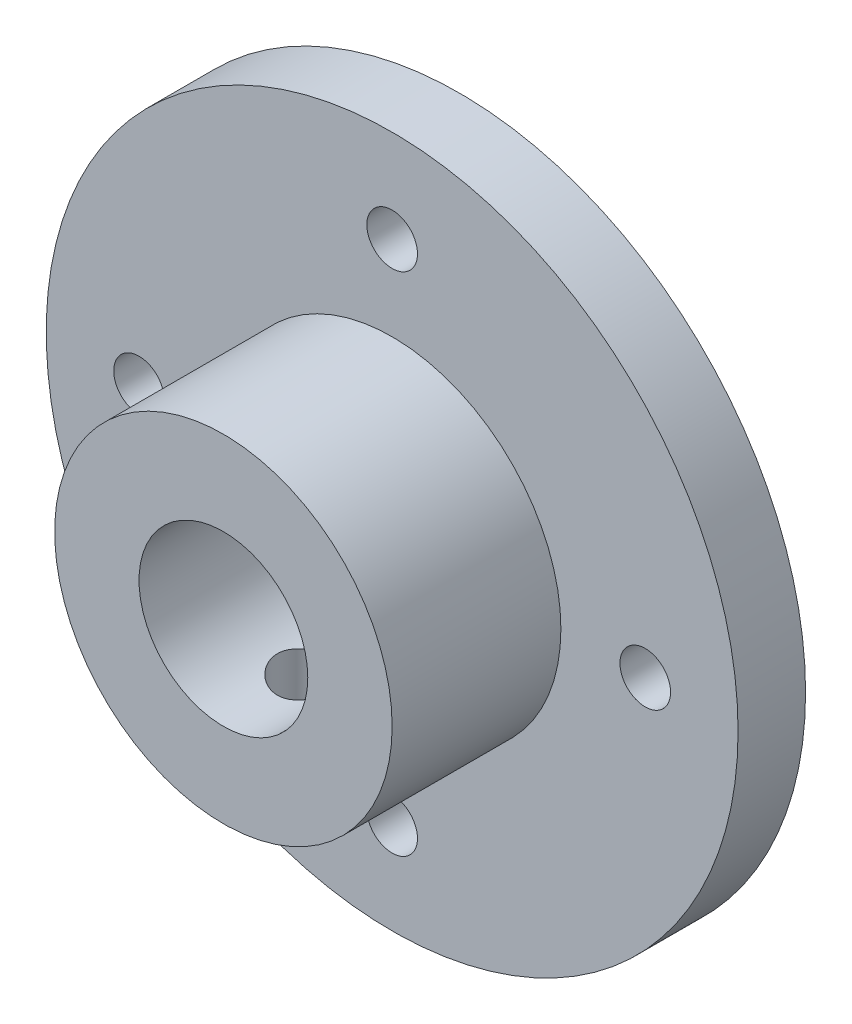
ISO-10303-21;
HEADER;
FILE_DESCRIPTION(('STEP AP214'),'2;1');
FILE_NAME('part.step','',(''),(''),'','','');
FILE_SCHEMA(('AUTOMOTIVE_DESIGN { 1 0 10303 214 1 1 1 1 }'));
ENDSEC;
DATA;
#1=APPLICATION_CONTEXT('core data for automotive mechanical design processes');
#2=APPLICATION_PROTOCOL_DEFINITION('international standard','automotive_design',2000,#1);
#3=PRODUCT_CONTEXT('',#1,'mechanical');
#4=PRODUCT('Part','Part','',(#3));
#5=PRODUCT_RELATED_PRODUCT_CATEGORY('part','',(#4));
#6=PRODUCT_DEFINITION_FORMATION('','',#4);
#7=PRODUCT_DEFINITION_CONTEXT('part definition',#1,'design');
#8=PRODUCT_DEFINITION('design','',#6,#7);
#9=PRODUCT_DEFINITION_SHAPE('','',#8);
#10=(LENGTH_UNIT() NAMED_UNIT(*) SI_UNIT(.MILLI.,.METRE.));
#11=(NAMED_UNIT(*) PLANE_ANGLE_UNIT() SI_UNIT($,.RADIAN.));
#12=(NAMED_UNIT(*) SI_UNIT($,.STERADIAN.) SOLID_ANGLE_UNIT());
#13=UNCERTAINTY_MEASURE_WITH_UNIT(LENGTH_MEASURE(1.E-05),#10,'distance_accuracy_value','');
#14=(GEOMETRIC_REPRESENTATION_CONTEXT(3) GLOBAL_UNCERTAINTY_ASSIGNED_CONTEXT((#13)) GLOBAL_UNIT_ASSIGNED_CONTEXT((#10,
#11,#12)) REPRESENTATION_CONTEXT('',''));
#15=CARTESIAN_POINT('',(0.,0.,0.));
#16=DIRECTION('',(0.,0.,1.));
#17=DIRECTION('',(1.,0.,0.));
#18=AXIS2_PLACEMENT_3D('',#15,#16,#17);
#19=CARTESIAN_POINT('',(0.,0.,4.));
#20=DIRECTION('',(0.,0.,1.));
#21=DIRECTION('',(1.,0.,0.));
#22=AXIS2_PLACEMENT_3D('',#19,#20,#21);
#23=PLANE('',#22);
#24=CARTESIAN_POINT('',(-15.,0.,4.));
#25=DIRECTION('',(0.,0.,1.));
#26=DIRECTION('',(1.,0.,0.));
#27=AXIS2_PLACEMENT_3D('',#24,#25,#26);
#28=CIRCLE('',#27,1.50000000000023);
#29=CARTESIAN_POINT('',(-13.4999999999998,0.,4.));
#30=VERTEX_POINT('',#29);
#31=EDGE_CURVE('E71',#30,#30,#28,.T.);
#32=ORIENTED_EDGE('',*,*,#31,.F.);
#33=EDGE_LOOP('',(#32));
#34=FACE_BOUND('',#33,.T.);
#35=CARTESIAN_POINT('',(15.,0.,4.));
#36=DIRECTION('',(0.,0.,1.));
#37=DIRECTION('',(1.,0.,0.));
#38=AXIS2_PLACEMENT_3D('',#35,#36,#37);
#39=CIRCLE('',#38,1.50000000000055);
#40=CARTESIAN_POINT('',(16.5000000000005,0.,4.));
#41=VERTEX_POINT('',#40);
#42=EDGE_CURVE('E59',#41,#41,#39,.T.);
#43=ORIENTED_EDGE('',*,*,#42,.F.);
#44=EDGE_LOOP('',(#43));
#45=FACE_BOUND('',#44,.T.);
#46=CARTESIAN_POINT('',(0.,0.,4.));
#47=DIRECTION('',(0.,0.,1.));
#48=DIRECTION('',(1.,0.,0.));
#49=AXIS2_PLACEMENT_3D('',#46,#47,#48);
#50=CIRCLE('',#49,20.5);
#51=CARTESIAN_POINT('',(20.5,0.,4.));
#52=VERTEX_POINT('',#51);
#53=EDGE_CURVE('E10',#52,#52,#50,.T.);
#54=ORIENTED_EDGE('',*,*,#53,.T.);
#55=EDGE_LOOP('',(#54));
#56=FACE_BOUND('',#55,.T.);
#57=CARTESIAN_POINT('',(0.,15.,4.));
#58=DIRECTION('',(0.,0.,1.));
#59=DIRECTION('',(1.,0.,0.));
#60=AXIS2_PLACEMENT_3D('',#57,#58,#59);
#61=CIRCLE('',#60,1.5);
#62=CARTESIAN_POINT('',(1.5,15.,4.));
#63=VERTEX_POINT('',#62);
#64=EDGE_CURVE('E55',#63,#63,#61,.T.);
#65=ORIENTED_EDGE('',*,*,#64,.F.);
#66=EDGE_LOOP('',(#65));
#67=FACE_BOUND('',#66,.T.);
#68=CARTESIAN_POINT('',(0.,-15.,4.));
#69=DIRECTION('',(0.,0.,1.));
#70=DIRECTION('',(1.,0.,0.));
#71=AXIS2_PLACEMENT_3D('',#68,#69,#70);
#72=CIRCLE('',#71,1.50000000000081);
#73=CARTESIAN_POINT('',(1.50000000000081,-15.,4.));
#74=VERTEX_POINT('',#73);
#75=EDGE_CURVE('E65',#74,#74,#72,.T.);
#76=ORIENTED_EDGE('',*,*,#75,.F.);
#77=EDGE_LOOP('',(#76));
#78=FACE_BOUND('',#77,.T.);
#79=CARTESIAN_POINT('',(-9.71445146547012E-13,4.44089209850063E-13,4.));
#80=DIRECTION('',(0.,0.,1.));
#81=DIRECTION('',(1.,0.,0.));
#82=AXIS2_PLACEMENT_3D('',#79,#80,#81);
#83=CIRCLE('',#82,10.);
#84=CARTESIAN_POINT('',(9.99999999999903,4.44089209850063E-13,4.));
#85=VERTEX_POINT('',#84);
#86=EDGE_CURVE('E80',#85,#85,#83,.T.);
#87=ORIENTED_EDGE('',*,*,#86,.F.);
#88=EDGE_LOOP('',(#87));
#89=FACE_BOUND('',#88,.T.);
#90=ADVANCED_FACE('F33',(#34,#45,#56,#67,#78,#89),#23,.T.);
#91=CARTESIAN_POINT('',(0.,0.,0.));
#92=DIRECTION('',(0.,0.,1.));
#93=DIRECTION('',(1.,0.,0.));
#94=AXIS2_PLACEMENT_3D('',#91,#92,#93);
#95=PLANE('',#94);
#96=CARTESIAN_POINT('',(0.,0.,0.));
#97=DIRECTION('',(0.,0.,1.));
#98=DIRECTION('',(1.,0.,0.));
#99=AXIS2_PLACEMENT_3D('',#96,#97,#98);
#100=CIRCLE('',#99,20.5);
#101=CARTESIAN_POINT('',(20.5,0.,0.));
#102=VERTEX_POINT('',#101);
#103=EDGE_CURVE('E46',#102,#102,#100,.T.);
#104=ORIENTED_EDGE('',*,*,#103,.F.);
#105=EDGE_LOOP('',(#104));
#106=FACE_BOUND('',#105,.T.);
#107=CARTESIAN_POINT('',(0.,0.,0.));
#108=DIRECTION('',(0.,0.,1.));
#109=DIRECTION('',(1.,0.,0.));
#110=AXIS2_PLACEMENT_3D('',#107,#108,#109);
#111=CIRCLE('',#110,5.);
#112=CARTESIAN_POINT('',(5.,0.,0.));
#113=VERTEX_POINT('',#112);
#114=EDGE_CURVE('E51',#113,#113,#111,.T.);
#115=ORIENTED_EDGE('',*,*,#114,.T.);
#116=EDGE_LOOP('',(#115));
#117=FACE_BOUND('',#116,.T.);
#118=CARTESIAN_POINT('',(0.,15.,0.));
#119=DIRECTION('',(0.,0.,1.));
#120=DIRECTION('',(1.,0.,0.));
#121=AXIS2_PLACEMENT_3D('',#118,#119,#120);
#122=CIRCLE('',#121,1.5);
#123=CARTESIAN_POINT('',(1.5,15.,0.));
#124=VERTEX_POINT('',#123);
#125=EDGE_CURVE('E56',#124,#124,#122,.T.);
#126=ORIENTED_EDGE('',*,*,#125,.T.);
#127=EDGE_LOOP('',(#126));
#128=FACE_BOUND('',#127,.T.);
#129=CARTESIAN_POINT('',(15.,0.,0.));
#130=DIRECTION('',(0.,0.,1.));
#131=DIRECTION('',(1.,0.,0.));
#132=AXIS2_PLACEMENT_3D('',#129,#130,#131);
#133=CIRCLE('',#132,1.50000000000055);
#134=CARTESIAN_POINT('',(16.5000000000005,0.,0.));
#135=VERTEX_POINT('',#134);
#136=EDGE_CURVE('E62',#135,#135,#133,.T.);
#137=ORIENTED_EDGE('',*,*,#136,.T.);
#138=EDGE_LOOP('',(#137));
#139=FACE_BOUND('',#138,.T.);
#140=CARTESIAN_POINT('',(0.,-15.,0.));
#141=DIRECTION('',(0.,0.,1.));
#142=DIRECTION('',(1.,0.,0.));
#143=AXIS2_PLACEMENT_3D('',#140,#141,#142);
#144=CIRCLE('',#143,1.50000000000081);
#145=CARTESIAN_POINT('',(1.50000000000081,-15.,0.));
#146=VERTEX_POINT('',#145);
#147=EDGE_CURVE('E68',#146,#146,#144,.T.);
#148=ORIENTED_EDGE('',*,*,#147,.T.);
#149=EDGE_LOOP('',(#148));
#150=FACE_BOUND('',#149,.T.);
#151=CARTESIAN_POINT('',(-15.,0.,0.));
#152=DIRECTION('',(0.,0.,1.));
#153=DIRECTION('',(1.,0.,0.));
#154=AXIS2_PLACEMENT_3D('',#151,#152,#153);
#155=CIRCLE('',#154,1.50000000000023);
#156=CARTESIAN_POINT('',(-13.4999999999998,0.,0.));
#157=VERTEX_POINT('',#156);
#158=EDGE_CURVE('E74',#157,#157,#155,.T.);
#159=ORIENTED_EDGE('',*,*,#158,.T.);
#160=EDGE_LOOP('',(#159));
#161=FACE_BOUND('',#160,.T.);
#162=ADVANCED_FACE('F133',(#106,#117,#128,#139,#150,#161),#95,.F.);
#163=CARTESIAN_POINT('',(0.,0.,4.));
#164=DIRECTION('',(0.,0.,-1.));
#165=DIRECTION('',(-1.,0.,0.));
#166=AXIS2_PLACEMENT_3D('',#163,#164,#165);
#167=CYLINDRICAL_SURFACE('',#166,20.5);
#168=ORIENTED_EDGE('',*,*,#103,.T.);
#169=EDGE_LOOP('',(#168));
#170=FACE_BOUND('',#169,.T.);
#171=ORIENTED_EDGE('',*,*,#53,.F.);
#172=EDGE_LOOP('',(#171));
#173=FACE_BOUND('',#172,.T.);
#174=ADVANCED_FACE('F35',(#170,#173),#167,.T.);
#175=CARTESIAN_POINT('',(0.,0.,4.));
#176=DIRECTION('',(0.,0.,-1.));
#177=DIRECTION('',(-1.,0.,0.));
#178=AXIS2_PLACEMENT_3D('',#175,#176,#177);
#179=CYLINDRICAL_SURFACE('',#178,5.);
#180=CARTESIAN_POINT('',(0.,-5.,10.8));
#181=CARTESIAN_POINT('',(0.0977539005220656,-5.00000162894436,10.8000022486898));
#182=CARTESIAN_POINT('',(0.19549186859532,-4.99710773532688,10.7920115005329));
#183=CARTESIAN_POINT('',(0.388062069248583,-4.98585098452281,10.7603771045906));
#184=CARTESIAN_POINT('',(0.482894461923503,-4.9774884292245,10.7367343208487));
#185=CARTESIAN_POINT('',(0.666849296818671,-4.95619614793934,10.6747300717925));
#186=CARTESIAN_POINT('',(0.755981868052519,-4.94327480564127,10.6363956136333));
#187=CARTESIAN_POINT('',(0.926548260436039,-4.91416362291193,10.5462278905699));
#188=CARTESIAN_POINT('',(1.00798019364839,-4.89797298399385,10.4943913270383));
#189=CARTESIAN_POINT('',(1.16405881904559,-4.86328998573904,10.3765420249719));
#190=CARTESIAN_POINT('',(1.23835945318508,-4.84473608608493,10.3100892282884));
#191=CARTESIAN_POINT('',(1.37503534000585,-4.8077334249031,10.1658283101059));
#192=CARTESIAN_POINT('',(1.43740734602632,-4.78928469332118,10.0880171072778));
#193=CARTESIAN_POINT('',(1.55057074838351,-4.75387995818921,9.91996655892296));
#194=CARTESIAN_POINT('',(1.60088792826236,-4.73699749021945,9.82939085862481));
#195=CARTESIAN_POINT('',(1.6854228567842,-4.70758621826686,9.64035790602146));
#196=CARTESIAN_POINT('',(1.71964646378813,-4.69505583048048,9.54190353699426));
#197=CARTESIAN_POINT('',(1.76968160506977,-4.6764216481749,9.34387619235186));
#198=CARTESIAN_POINT('',(1.78614945231922,-4.67008963439852,9.24449121292766));
#199=CARTESIAN_POINT('',(1.80225793087739,-4.66389839037948,9.0441824060667));
#200=CARTESIAN_POINT('',(1.80190483021864,-4.66403674906515,8.94325916585017));
#201=CARTESIAN_POINT('',(1.78488611393202,-4.67057263169623,8.74858544763738));
#202=CARTESIAN_POINT('',(1.76910996810181,-4.67662885465459,8.65474367844102));
#203=CARTESIAN_POINT('',(1.7231561899951,-4.69375412059264,8.47114129370321));
#204=CARTESIAN_POINT('',(1.69297655939616,-4.70482385913068,8.38138124634822));
#205=CARTESIAN_POINT('',(1.61855003044875,-4.73094806499027,8.20660082941754));
#206=CARTESIAN_POINT('',(1.57406042926296,-4.74607046920848,8.12169440850682));
#207=CARTESIAN_POINT('',(1.47244565703815,-4.77857129112204,7.96028560459117));
#208=CARTESIAN_POINT('',(1.41531637409282,-4.79595044221429,7.88378596860743));
#209=CARTESIAN_POINT('',(1.2858992766173,-4.83231258907654,7.73640984648249));
#210=CARTESIAN_POINT('',(1.21289487774954,-4.85132846190871,7.66616928668949));
#211=CARTESIAN_POINT('',(1.05591731188325,-4.88789590383164,7.53874730697894));
#212=CARTESIAN_POINT('',(0.971942715431738,-4.90544728160461,7.48156759160592));
#213=CARTESIAN_POINT('',(0.793888911912651,-4.9374100153501,7.38126165638015));
#214=CARTESIAN_POINT('',(0.699690547577895,-4.95177667827947,7.33833171155428));
#215=CARTESIAN_POINT('',(0.504764518320661,-4.97542272602833,7.26913413197704));
#216=CARTESIAN_POINT('',(0.404039535231999,-4.98470418575491,7.2428597006159));
#217=CARTESIAN_POINT('',(0.204283387412952,-4.99677710334146,7.20890559450815));
#218=CARTESIAN_POINT('',(0.105415869319371,-4.99986753773914,7.20036852807256));
#219=CARTESIAN_POINT('',(-0.0923750023190853,-5.00012395917945,7.19965509178144));
#220=CARTESIAN_POINT('',(-0.191298340606719,-4.997291139387,7.2074754269336));
#221=CARTESIAN_POINT('',(-0.382789975742196,-4.98621692403337,7.23859238731632));
#222=CARTESIAN_POINT('',(-0.475459615362869,-4.97816730971769,7.26134058924165));
#223=CARTESIAN_POINT('',(-0.655612646716864,-4.95766056423162,7.32095908174288));
#224=CARTESIAN_POINT('',(-0.743095362746147,-4.9452028602829,7.35783120760454));
#225=CARTESIAN_POINT('',(-0.913170903396116,-4.916682772083,7.44579751279469));
#226=CARTESIAN_POINT('',(-0.995554173685095,-4.90052802714165,7.49726600812159));
#227=CARTESIAN_POINT('',(-1.15078022519772,-4.86641871458374,7.61253526987975));
#228=CARTESIAN_POINT('',(-1.22361967727807,-4.84846352275745,7.6763403205247));
#229=CARTESIAN_POINT('',(-1.3617486376426,-4.811551228019,7.81848564893913));
#230=CARTESIAN_POINT('',(-1.42642787987676,-4.7925917871223,7.89741985801346));
#231=CARTESIAN_POINT('',(-1.54172624068029,-4.75675694030122,8.06541026283921));
#232=CARTESIAN_POINT('',(-1.5923445897341,-4.73988164846487,8.15446701219482));
#233=CARTESIAN_POINT('',(-1.67801139570526,-4.71023855020625,8.34061713109472));
#234=CARTESIAN_POINT('',(-1.71303617657441,-4.69747699781408,8.43772245762556));
#235=CARTESIAN_POINT('',(-1.76603303137155,-4.6778137938696,8.63703300151576));
#236=CARTESIAN_POINT('',(-1.78401454624956,-4.67090889830278,8.73923536235508));
#237=CARTESIAN_POINT('',(-1.80160793933699,-4.66414933087026,8.93928552176567));
#238=CARTESIAN_POINT('',(-1.80224993772542,-4.66389931416239,9.03703021658078));
#239=CARTESIAN_POINT('',(-1.7877467991413,-4.66947753612564,9.2311552222564));
#240=CARTESIAN_POINT('',(-1.77260293003024,-4.67530528665338,9.32753564206024));
#241=CARTESIAN_POINT('',(-1.7277347484119,-4.69206559069064,9.51367900768928));
#242=CARTESIAN_POINT('',(-1.69839819136883,-4.70286203339625,9.60354868926149));
#243=CARTESIAN_POINT('',(-1.62630780484078,-4.72827416749676,9.77715042398891));
#244=CARTESIAN_POINT('',(-1.58355071925154,-4.7428907856029,9.86088098157463));
#245=CARTESIAN_POINT('',(-1.48338009116916,-4.77519415910409,10.0243130968826));
#246=CARTESIAN_POINT('',(-1.42534759276845,-4.79299679558947,10.1036121499243));
#247=CARTESIAN_POINT('',(-1.29726372893642,-4.82923722712649,10.2516771304164));
#248=CARTESIAN_POINT('',(-1.22720869966673,-4.84767521442682,10.3204398348118));
#249=CARTESIAN_POINT('',(-1.07301971415378,-4.88417774598827,10.4488508823763));
#250=CARTESIAN_POINT('',(-0.98836942629757,-4.90218131274306,10.5078991243242));
#251=CARTESIAN_POINT('',(-0.809724853210542,-4.93483332399765,10.6108918212905));
#252=CARTESIAN_POINT('',(-0.715731056307327,-4.94948194370777,10.654837065115));
#253=CARTESIAN_POINT('',(-0.519977220258172,-4.97387564350888,10.7264387400094));
#254=CARTESIAN_POINT('',(-0.418147091546831,-4.98356860138462,10.7539225304002));
#255=CARTESIAN_POINT('',(-0.210870806770419,-4.99662861614133,10.7906982521383));
#256=CARTESIAN_POINT('',(-0.105426137627545,-4.99999824320757,10.7999975748213));
#257=CARTESIAN_POINT('',(0.,-5.,10.8));
#258=B_SPLINE_CURVE_WITH_KNOTS('',3,(#180,#181,#182,#183,#184,#185,#186,#187,#188,#189,#190,
#191,#192,#193,#194,#195,#196,#197,#198,#199,#200,#201,#202,#203,#204,#205,#206,#207,#208,#209,
#210,#211,#212,#213,#214,#215,#216,#217,#218,#219,#220,#221,#222,#223,#224,#225,#226,#227,#228,
#229,#230,#231,#232,#233,#234,#235,#236,#237,#238,#239,#240,#241,#242,#243,#244,#245,#246,#247,
#248,#249,#250,#251,#252,#253,#254,#255,#256,#257),.UNSPECIFIED.,.T.,.F.,(4,2,2,2,2,2,2,2,2,2,2,
2,2,2,2,2,2,2,2,2,2,2,2,2,2,2,2,2,2,2,2,2,2,2,2,2,2,2,4),(0.,0.292873157445703,
0.585730148685314,0.87805135424108,1.17044404232025,1.47327609516021,1.77619045403607,
2.0895638844129,2.40282315253744,2.70405814416762,3.00518088671658,3.28990369328593,
3.5746660134492,3.86453804810327,4.15450452214734,4.46231862667985,4.77017288048848,
5.08210674886457,5.39391324441087,5.69025938241882,5.98654583098265,6.27251452651293,
6.55852039389546,6.85265234805883,7.14688663183031,7.45682137285936,7.76677307245843,
8.07719378668826,8.38744244573848,8.67921628640297,8.97096669469573,9.25516146387285,
9.53942523808359,9.83771174622037,10.136089318424,10.4488683333084,10.7616310097483,
11.0776188480076,11.3934782217962),.UNSPECIFIED.);
#259=CARTESIAN_POINT('',(0.,-5.,10.8));
#260=VERTEX_POINT('',#259);
#261=EDGE_CURVE('E88',#260,#260,#258,.T.);
#262=ORIENTED_EDGE('',*,*,#261,.F.);
#263=EDGE_LOOP('',(#262));
#264=FACE_BOUND('',#263,.T.);
#265=ORIENTED_EDGE('',*,*,#114,.F.);
#266=EDGE_LOOP('',(#265));
#267=FACE_BOUND('',#266,.T.);
#268=CARTESIAN_POINT('',(-9.71445146547012E-13,4.44089209850063E-13,14.));
#269=DIRECTION('',(0.,0.,1.));
#270=DIRECTION('',(1.,0.,0.));
#271=AXIS2_PLACEMENT_3D('',#268,#269,#270);
#272=CIRCLE('',#271,5.);
#273=CARTESIAN_POINT('',(4.99999999999903,4.44089209850063E-13,14.));
#274=VERTEX_POINT('',#273);
#275=EDGE_CURVE('E83',#274,#274,#272,.T.);
#276=ORIENTED_EDGE('',*,*,#275,.T.);
#277=EDGE_LOOP('',(#276));
#278=FACE_BOUND('',#277,.T.);
#279=ADVANCED_FACE('F94',(#264,#267,#278),#179,.F.);
#280=CARTESIAN_POINT('',(0.,15.,4.));
#281=DIRECTION('',(0.,0.,-1.));
#282=DIRECTION('',(-1.,0.,0.));
#283=AXIS2_PLACEMENT_3D('',#280,#281,#282);
#284=CYLINDRICAL_SURFACE('',#283,1.5);
#285=ORIENTED_EDGE('',*,*,#125,.F.);
#286=EDGE_LOOP('',(#285));
#287=FACE_BOUND('',#286,.T.);
#288=ORIENTED_EDGE('',*,*,#64,.T.);
#289=EDGE_LOOP('',(#288));
#290=FACE_BOUND('',#289,.T.);
#291=ADVANCED_FACE('F122',(#287,#290),#284,.F.);
#292=CARTESIAN_POINT('',(15.,0.,4.));
#293=DIRECTION('',(0.,0.,-1.));
#294=DIRECTION('',(-1.,0.,0.));
#295=AXIS2_PLACEMENT_3D('',#292,#293,#294);
#296=CYLINDRICAL_SURFACE('',#295,1.50000000000055);
#297=ORIENTED_EDGE('',*,*,#136,.F.);
#298=EDGE_LOOP('',(#297));
#299=FACE_BOUND('',#298,.T.);
#300=ORIENTED_EDGE('',*,*,#42,.T.);
#301=EDGE_LOOP('',(#300));
#302=FACE_BOUND('',#301,.T.);
#303=ADVANCED_FACE('F119',(#299,#302),#296,.F.);
#304=CARTESIAN_POINT('',(0.,-15.,4.));
#305=DIRECTION('',(0.,0.,-1.));
#306=DIRECTION('',(-1.,0.,0.));
#307=AXIS2_PLACEMENT_3D('',#304,#305,#306);
#308=CYLINDRICAL_SURFACE('',#307,1.50000000000081);
#309=ORIENTED_EDGE('',*,*,#147,.F.);
#310=EDGE_LOOP('',(#309));
#311=FACE_BOUND('',#310,.T.);
#312=ORIENTED_EDGE('',*,*,#75,.T.);
#313=EDGE_LOOP('',(#312));
#314=FACE_BOUND('',#313,.T.);
#315=ADVANCED_FACE('F115',(#311,#314),#308,.F.);
#316=CARTESIAN_POINT('',(-15.,0.,4.));
#317=DIRECTION('',(0.,0.,-1.));
#318=DIRECTION('',(-1.,0.,0.));
#319=AXIS2_PLACEMENT_3D('',#316,#317,#318);
#320=CYLINDRICAL_SURFACE('',#319,1.50000000000023);
#321=ORIENTED_EDGE('',*,*,#158,.F.);
#322=EDGE_LOOP('',(#321));
#323=FACE_BOUND('',#322,.T.);
#324=ORIENTED_EDGE('',*,*,#31,.T.);
#325=EDGE_LOOP('',(#324));
#326=FACE_BOUND('',#325,.T.);
#327=ADVANCED_FACE('F107',(#323,#326),#320,.F.);
#328=CARTESIAN_POINT('',(-9.71445146547012E-13,4.44089209850063E-13,14.));
#329=DIRECTION('',(0.,0.,1.));
#330=DIRECTION('',(1.,0.,0.));
#331=AXIS2_PLACEMENT_3D('',#328,#329,#330);
#332=PLANE('',#331);
#333=CARTESIAN_POINT('',(-9.71445146547012E-13,4.44089209850063E-13,14.));
#334=DIRECTION('',(0.,0.,1.));
#335=DIRECTION('',(1.,0.,0.));
#336=AXIS2_PLACEMENT_3D('',#333,#334,#335);
#337=CIRCLE('',#336,10.);
#338=CARTESIAN_POINT('',(9.99999999999903,4.44089209850063E-13,14.));
#339=VERTEX_POINT('',#338);
#340=EDGE_CURVE('E77',#339,#339,#337,.T.);
#341=ORIENTED_EDGE('',*,*,#340,.T.);
#342=EDGE_LOOP('',(#341));
#343=FACE_BOUND('',#342,.T.);
#344=ORIENTED_EDGE('',*,*,#275,.F.);
#345=EDGE_LOOP('',(#344));
#346=FACE_BOUND('',#345,.T.);
#347=ADVANCED_FACE('F104',(#343,#346),#332,.T.);
#348=CARTESIAN_POINT('',(-9.71445146547012E-13,4.44089209850063E-13,14.));
#349=DIRECTION('',(0.,0.,-1.));
#350=DIRECTION('',(-1.,0.,0.));
#351=AXIS2_PLACEMENT_3D('',#348,#349,#350);
#352=CYLINDRICAL_SURFACE('',#351,10.);
#353=CARTESIAN_POINT('',(0.,-9.99999999999956,10.8));
#354=CARTESIAN_POINT('',(0.100238945589441,-9.99999821399249,10.7999960951789));
#355=CARTESIAN_POINT('',(0.200529550766878,-9.99847720986588,10.7915985021514));
#356=CARTESIAN_POINT('',(0.398289582932329,-9.99255617232693,10.7582487718759));
#357=CARTESIAN_POINT('',(0.495756471881549,-9.988153627914,10.7332821959997));
#358=CARTESIAN_POINT('',(0.684979998464896,-9.9769624846682,10.6675796652411));
#359=CARTESIAN_POINT('',(0.776741532237005,-9.97017596589558,10.6268574543009));
#360=CARTESIAN_POINT('',(0.952120070074717,-9.95495985693503,10.5308375214113));
#361=CARTESIAN_POINT('',(1.03573783316899,-9.94653042009317,10.475541159609));
#362=CARTESIAN_POINT('',(1.1933911364161,-9.92885598719414,10.35129187501));
#363=CARTESIAN_POINT('',(1.26732340001678,-9.91960373073971,10.2822089291607));
#364=CARTESIAN_POINT('',(1.4026140819556,-9.90138095344044,10.1326272645549));
#365=CARTESIAN_POINT('',(1.46397163936646,-9.89241045192152,10.052127764802));
#366=CARTESIAN_POINT('',(1.57279495597013,-9.87569641152469,9.88127575193319));
#367=CARTESIAN_POINT('',(1.62015674248873,-9.86796224257854,9.79085601690439));
#368=CARTESIAN_POINT('',(1.6989787671357,-9.85469831531993,9.6031810948998));
#369=CARTESIAN_POINT('',(1.73044026460049,-9.84916838243467,9.50592644995848));
#370=CARTESIAN_POINT('',(1.77623941282681,-9.84101184996514,9.3084437540773));
#371=CARTESIAN_POINT('',(1.79075651857426,-9.83835484630297,9.20825860161172));
#372=CARTESIAN_POINT('',(1.80281158717447,-9.83615323649047,9.00684200186934));
#373=CARTESIAN_POINT('',(1.80035095216272,-9.83660837331871,8.90561064168483));
#374=CARTESIAN_POINT('',(1.7786661463919,-9.84055190821192,8.70626817164071));
#375=CARTESIAN_POINT('',(1.75964510852474,-9.84400354915013,8.60813413067355));
#376=CARTESIAN_POINT('',(1.70569892082229,-9.8534935196434,8.41647325177884));
#377=CARTESIAN_POINT('',(1.67077314344092,-9.85953195126374,8.32294659580417));
#378=CARTESIAN_POINT('',(1.58580752944048,-9.8735540281827,8.14255588550273));
#379=CARTESIAN_POINT('',(1.53568480465858,-9.88154829374079,8.05573173179615));
#380=CARTESIAN_POINT('',(1.42180680023042,-9.89857413790948,7.89164959748605));
#381=CARTESIAN_POINT('',(1.35805024226319,-9.90760581375187,7.81439251497341));
#382=CARTESIAN_POINT('',(1.21761486344257,-9.9258495071372,7.6704630904825));
#383=CARTESIAN_POINT('',(1.14076209152133,-9.93506224084965,7.60396045093819));
#384=CARTESIAN_POINT('',(0.976900242231838,-9.95250941190146,7.48476727732122));
#385=CARTESIAN_POINT('',(0.889891077609167,-9.9607438408349,7.43207686192317));
#386=CARTESIAN_POINT('',(0.70801581509668,-9.97532130627379,7.34198241149673));
#387=CARTESIAN_POINT('',(0.613141290374182,-9.98166227980684,7.30459503323624));
#388=CARTESIAN_POINT('',(0.418319402431788,-9.99172223165479,7.24633424559017));
#389=CARTESIAN_POINT('',(0.318372536242685,-9.99544146634002,7.22545922149692));
#390=CARTESIAN_POINT('',(0.11770408679548,-9.9998039459246,7.2010496160775));
#391=CARTESIAN_POINT('',(0.0170116747450747,-10.0004884630015,7.19728235183182));
#392=CARTESIAN_POINT('',(-0.183564689363621,-9.99881802730858,7.20657247682238));
#393=CARTESIAN_POINT('',(-0.283448677705017,-9.99646321171776,7.21962910671941));
#394=CARTESIAN_POINT('',(-0.478842019701554,-9.98900434047135,7.26200289333456));
#395=CARTESIAN_POINT('',(-0.574377520779301,-9.98392003875754,7.29120325873693));
#396=CARTESIAN_POINT('',(-0.759197028738608,-9.97156990570855,7.36490994277637));
#397=CARTESIAN_POINT('',(-0.848480637218519,-9.96430393550236,7.40941723578047));
#398=CARTESIAN_POINT('',(-1.01926157553974,-9.94829358375475,7.51299603926079));
#399=CARTESIAN_POINT('',(-1.1006705912898,-9.93953493309282,7.57221091245129));
#400=CARTESIAN_POINT('',(-1.25247966888522,-9.92154972657059,7.70332880093835));
#401=CARTESIAN_POINT('',(-1.3228787876625,-9.91232313071734,7.77523290202687));
#402=CARTESIAN_POINT('',(-1.45154582891003,-9.89430628800551,7.93073799926948));
#403=CARTESIAN_POINT('',(-1.50965553210133,-9.88552272549754,8.01447080897862));
#404=CARTESIAN_POINT('',(-1.61098458878922,-9.86951727053872,8.19064612074168));
#405=CARTESIAN_POINT('',(-1.65420446756144,-9.86229532300134,8.28308831540384));
#406=CARTESIAN_POINT('',(-1.72429807083465,-9.85028240148572,8.47364146889596));
#407=CARTESIAN_POINT('',(-1.75124663334056,-9.84548031478704,8.57172416619539));
#408=CARTESIAN_POINT('',(-1.7882653134712,-9.83882447877106,8.77111894321069));
#409=CARTESIAN_POINT('',(-1.79833717006772,-9.83697042569009,8.8724306891098));
#410=CARTESIAN_POINT('',(-1.801261930236,-9.83643513514475,9.07382477896747));
#411=CARTESIAN_POINT('',(-1.79436419377963,-9.83770794948088,9.17390346532375));
#412=CARTESIAN_POINT('',(-1.76408899052729,-9.84318153644745,9.37145048863815));
#413=CARTESIAN_POINT('',(-1.74071160439765,-9.84738229474588,9.4689188383712));
#414=CARTESIAN_POINT('',(-1.67824236470901,-9.85821979669534,9.65835831369467));
#415=CARTESIAN_POINT('',(-1.63917545956921,-9.86485267150852,9.75033790169299));
#416=CARTESIAN_POINT('',(-1.54646274995024,-9.87981013162376,9.92647729333468));
#417=CARTESIAN_POINT('',(-1.49281602822491,-9.88813482335317,10.0106366045412));
#418=CARTESIAN_POINT('',(-1.37159096777602,-9.90568171059481,10.1699996435025));
#419=CARTESIAN_POINT('',(-1.3038303931107,-9.91491471682086,10.2450635792334));
#420=CARTESIAN_POINT('',(-1.15668291181179,-9.93315507021657,10.3828394396228));
#421=CARTESIAN_POINT('',(-1.07729333527512,-9.9421623650075,10.4455485199554));
#422=CARTESIAN_POINT('',(-0.908363296955448,-9.95902272806862,10.5573115261197));
#423=CARTESIAN_POINT('',(-0.818744924967683,-9.96686572439751,10.6062492447052));
#424=CARTESIAN_POINT('',(-0.632449153751762,-9.98041568975921,10.6882971240125));
#425=CARTESIAN_POINT('',(-0.535778638693587,-9.98612470945656,10.7214224882891));
#426=CARTESIAN_POINT('',(-0.365657064746943,-9.99356875474065,10.764005110379));
#427=CARTESIAN_POINT('',(-0.293214157519526,-9.99596712668052,10.777480675086));
#428=CARTESIAN_POINT('',(-0.14719010248268,-9.99918338757909,10.7954794545243));
#429=CARTESIAN_POINT('',(-0.0736089799085321,-10.0000013115273,10.8000028674473));
#430=CARTESIAN_POINT('',(0.,-9.99999999999956,10.8));
#431=B_SPLINE_CURVE_WITH_KNOTS('',3,(#353,#354,#355,#356,#357,#358,#359,#360,#361,#362,#363,
#364,#365,#366,#367,#368,#369,#370,#371,#372,#373,#374,#375,#376,#377,#378,#379,#380,#381,#382,
#383,#384,#385,#386,#387,#388,#389,#390,#391,#392,#393,#394,#395,#396,#397,#398,#399,#400,#401,
#402,#403,#404,#405,#406,#407,#408,#409,#410,#411,#412,#413,#414,#415,#416,#417,#418,#419,#420,
#421,#422,#423,#424,#425,#426,#427,#428,#429,#430),.UNSPECIFIED.,.T.,.F.,(4,2,2,2,2,2,2,2,2,2,2,
2,2,2,2,2,2,2,2,2,2,2,2,2,2,2,2,2,2,2,2,2,2,2,2,2,2,2,4),(0.,0.300447693685808,
0.601157549440921,0.901605679507042,1.20202577987643,1.50542584393083,1.80884667333663,
2.11446796124314,2.42006503950427,2.72239535258012,3.02470069749379,3.32334933646824,
3.62200976010749,3.92232939053899,4.22267719157632,4.52737957659405,4.83208457952835,
5.13712036578742,5.44212631956288,5.74297120883116,6.04380252007062,6.34248542873416,
6.64118735366708,6.94292375245915,7.24468598276419,7.55012405689499,7.85555135483382,
8.15956295736222,8.46354323268004,8.7630834171693,9.06262213544774,9.36168642143691,
9.66076952653046,9.96398468950014,10.2672695770843,10.5730417812191,10.87851939068,
11.0991535738547,11.3197828723577),.UNSPECIFIED.);
#432=CARTESIAN_POINT('',(0.,-9.99999999999956,10.8));
#433=VERTEX_POINT('',#432);
#434=EDGE_CURVE('E37',#433,#433,#431,.T.);
#435=ORIENTED_EDGE('',*,*,#434,.T.);
#436=EDGE_LOOP('',(#435));
#437=FACE_BOUND('',#436,.T.);
#438=ORIENTED_EDGE('',*,*,#340,.F.);
#439=EDGE_LOOP('',(#438));
#440=FACE_BOUND('',#439,.T.);
#441=ORIENTED_EDGE('',*,*,#86,.T.);
#442=EDGE_LOOP('',(#441));
#443=FACE_BOUND('',#442,.T.);
#444=ADVANCED_FACE('F102',(#437,#440,#443),#352,.T.);
#445=CARTESIAN_POINT('',(0.,-13.,9.));
#446=DIRECTION('',(0.,1.,0.));
#447=DIRECTION('',(0.,0.,1.));
#448=AXIS2_PLACEMENT_3D('',#445,#446,#447);
#449=CYLINDRICAL_SURFACE('',#448,1.8);
#450=ORIENTED_EDGE('',*,*,#261,.T.);
#451=EDGE_LOOP('',(#450));
#452=FACE_BOUND('',#451,.T.);
#453=ORIENTED_EDGE('',*,*,#434,.F.);
#454=EDGE_LOOP('',(#453));
#455=FACE_BOUND('',#454,.T.);
#456=ADVANCED_FACE('F98',(#452,#455),#449,.F.);
#457=CLOSED_SHELL('',(#90,#162,#174,#279,#291,#303,#315,#327,#347,#444,#456));
#458=MANIFOLD_SOLID_BREP('B2',#457);
#459=ADVANCED_BREP_SHAPE_REPRESENTATION('',(#18,#458),#14);
#460=SHAPE_DEFINITION_REPRESENTATION(#9,#459);
ENDSEC;
END-ISO-10303-21;
